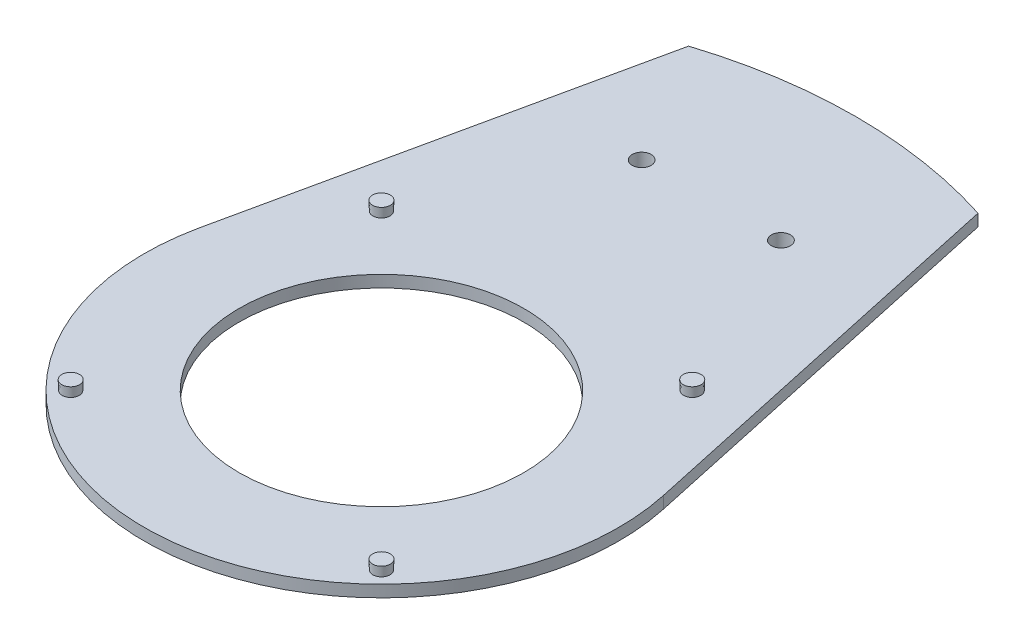
ISO-10303-21;
HEADER;
FILE_DESCRIPTION(('STEP AP214'),'2;1');
FILE_NAME('part.step','',(''),(''),'','','');
FILE_SCHEMA(('AUTOMOTIVE_DESIGN { 1 0 10303 214 1 1 1 1 }'));
ENDSEC;
DATA;
#1=APPLICATION_CONTEXT('core data for automotive mechanical design processes');
#2=APPLICATION_PROTOCOL_DEFINITION('international standard','automotive_design',2000,#1);
#3=PRODUCT_CONTEXT('',#1,'mechanical');
#4=PRODUCT('Part','Part','',(#3));
#5=PRODUCT_RELATED_PRODUCT_CATEGORY('part','',(#4));
#6=PRODUCT_DEFINITION_FORMATION('','',#4);
#7=PRODUCT_DEFINITION_CONTEXT('part definition',#1,'design');
#8=PRODUCT_DEFINITION('design','',#6,#7);
#9=PRODUCT_DEFINITION_SHAPE('','',#8);
#10=(LENGTH_UNIT() NAMED_UNIT(*) SI_UNIT(.MILLI.,.METRE.));
#11=(NAMED_UNIT(*) PLANE_ANGLE_UNIT() SI_UNIT($,.RADIAN.));
#12=(NAMED_UNIT(*) SI_UNIT($,.STERADIAN.) SOLID_ANGLE_UNIT());
#13=UNCERTAINTY_MEASURE_WITH_UNIT(LENGTH_MEASURE(1.E-05),#10,'distance_accuracy_value','');
#14=(GEOMETRIC_REPRESENTATION_CONTEXT(3) GLOBAL_UNCERTAINTY_ASSIGNED_CONTEXT((#13)) GLOBAL_UNIT_ASSIGNED_CONTEXT((#10,
#11,#12)) REPRESENTATION_CONTEXT('',''));
#15=CARTESIAN_POINT('',(0.,0.,0.));
#16=DIRECTION('',(0.,0.,1.));
#17=DIRECTION('',(1.,0.,0.));
#18=AXIS2_PLACEMENT_3D('',#15,#16,#17);
#19=CARTESIAN_POINT('',(0.,0.,0.));
#20=DIRECTION('',(0.,1.,0.));
#21=DIRECTION('',(0.,0.,1.));
#22=AXIS2_PLACEMENT_3D('',#19,#20,#21);
#23=PLANE('',#22);
#24=CARTESIAN_POINT('',(0.,0.,0.));
#25=DIRECTION('',(0.,-1.,0.));
#26=DIRECTION('',(0.,0.,-1.));
#27=AXIS2_PLACEMENT_3D('',#24,#25,#26);
#28=CIRCLE('',#27,50.);
#29=CARTESIAN_POINT('',(48.8630664556427,0.,-10.6019213613123));
#30=VERTEX_POINT('',#29);
#31=CARTESIAN_POINT('',(-48.8630664556426,0.,-10.6019213613123));
#32=VERTEX_POINT('',#31);
#33=EDGE_CURVE('E109',#30,#32,#28,.T.);
#34=ORIENTED_EDGE('',*,*,#33,.T.);
#35=DIRECTION('',(-0.212038427226246,0.,0.977261329112853));
#36=VECTOR('',#35,1.);
#37=CARTESIAN_POINT('',(-48.8630664556426,0.,-10.6019213613123));
#38=LINE('',#37,#36);
#39=CARTESIAN_POINT('',(-30.5,0.,-95.2352350760999));
#40=VERTEX_POINT('',#39);
#41=EDGE_CURVE('E106',#40,#32,#38,.T.);
#42=ORIENTED_EDGE('',*,*,#41,.F.);
#43=CARTESIAN_POINT('',(0.,0.,0.));
#44=DIRECTION('',(0.,1.,0.));
#45=DIRECTION('',(0.,0.,1.));
#46=AXIS2_PLACEMENT_3D('',#43,#44,#45);
#47=CIRCLE('',#46,100.);
#48=CARTESIAN_POINT('',(30.5,0.,-95.2352350760999));
#49=VERTEX_POINT('',#48);
#50=EDGE_CURVE('E120',#49,#40,#47,.T.);
#51=ORIENTED_EDGE('',*,*,#50,.F.);
#52=DIRECTION('',(0.212038427226246,0.,0.977261329112853));
#53=VECTOR('',#52,1.);
#54=CARTESIAN_POINT('',(48.8630664556427,0.,-10.6019213613123));
#55=LINE('',#54,#53);
#56=EDGE_CURVE('E102',#49,#30,#55,.T.);
#57=ORIENTED_EDGE('',*,*,#56,.T.);
#58=EDGE_LOOP('',(#34,#42,#51,#57));
#59=FACE_BOUND('',#58,.T.);
#60=CARTESIAN_POINT('',(0.,0.,0.));
#61=DIRECTION('',(0.,1.,0.));
#62=DIRECTION('',(0.,0.,1.));
#63=AXIS2_PLACEMENT_3D('',#60,#61,#62);
#64=CIRCLE('',#63,30.);
#65=CARTESIAN_POINT('',(0.,0.,30.));
#66=VERTEX_POINT('',#65);
#67=EDGE_CURVE('E193',#66,#66,#64,.T.);
#68=ORIENTED_EDGE('',*,*,#67,.T.);
#69=EDGE_LOOP('',(#68));
#70=FACE_BOUND('',#69,.T.);
#71=DIRECTION('',(0.,0.,1.));
#72=VECTOR('',#71,1.);
#73=CARTESIAN_POINT('',(21.5,0.,0.));
#74=LINE('',#73,#72);
#75=CARTESIAN_POINT('',(21.5,0.,-84.45));
#76=VERTEX_POINT('',#75);
#77=CARTESIAN_POINT('',(21.5,0.,-54.45));
#78=VERTEX_POINT('',#77);
#79=EDGE_CURVE('E140',#76,#78,#74,.T.);
#80=ORIENTED_EDGE('',*,*,#79,.F.);
#81=DIRECTION('',(-1.,0.,0.));
#82=VECTOR('',#81,1.);
#83=CARTESIAN_POINT('',(0.,0.,-84.45));
#84=LINE('',#83,#82);
#85=CARTESIAN_POINT('',(-21.5,0.,-84.45));
#86=VERTEX_POINT('',#85);
#87=EDGE_CURVE('E145',#76,#86,#84,.T.);
#88=ORIENTED_EDGE('',*,*,#87,.T.);
#89=DIRECTION('',(0.,0.,1.));
#90=VECTOR('',#89,1.);
#91=CARTESIAN_POINT('',(-21.5,0.,0.));
#92=LINE('',#91,#90);
#93=CARTESIAN_POINT('',(-21.5,0.,-54.45));
#94=VERTEX_POINT('',#93);
#95=EDGE_CURVE('E59',#86,#94,#92,.T.);
#96=ORIENTED_EDGE('',*,*,#95,.T.);
#97=DIRECTION('',(-1.,0.,0.));
#98=VECTOR('',#97,1.);
#99=CARTESIAN_POINT('',(0.,0.,-54.45));
#100=LINE('',#99,#98);
#101=EDGE_CURVE('E156',#78,#94,#100,.T.);
#102=ORIENTED_EDGE('',*,*,#101,.F.);
#103=EDGE_LOOP('',(#80,#88,#96,#102));
#104=FACE_BOUND('',#103,.T.);
#105=ADVANCED_FACE('F36',(#59,#70,#104),#23,.F.);
#106=CARTESIAN_POINT('',(0.,2.5,0.));
#107=DIRECTION('',(0.,-1.,0.));
#108=DIRECTION('',(0.,0.,-1.));
#109=AXIS2_PLACEMENT_3D('',#106,#107,#108);
#110=CYLINDRICAL_SURFACE('',#109,30.);
#111=CARTESIAN_POINT('',(0.,2.5,0.));
#112=DIRECTION('',(0.,1.,0.));
#113=DIRECTION('',(0.,0.,1.));
#114=AXIS2_PLACEMENT_3D('',#111,#112,#113);
#115=CIRCLE('',#114,30.);
#116=CARTESIAN_POINT('',(0.,2.5,30.));
#117=VERTEX_POINT('',#116);
#118=EDGE_CURVE('E194',#117,#117,#115,.T.);
#119=ORIENTED_EDGE('',*,*,#118,.T.);
#120=EDGE_LOOP('',(#119));
#121=FACE_BOUND('',#120,.T.);
#122=ORIENTED_EDGE('',*,*,#67,.F.);
#123=EDGE_LOOP('',(#122));
#124=FACE_BOUND('',#123,.T.);
#125=ADVANCED_FACE('F38',(#121,#124),#110,.F.);
#126=CARTESIAN_POINT('',(0.,2.5,0.));
#127=DIRECTION('',(0.,-1.,0.));
#128=DIRECTION('',(0.,0.,-1.));
#129=AXIS2_PLACEMENT_3D('',#126,#127,#128);
#130=CYLINDRICAL_SURFACE('',#129,100.);
#131=ORIENTED_EDGE('',*,*,#50,.T.);
#132=DIRECTION('',(0.,-1.,0.));
#133=VECTOR('',#132,1.);
#134=CARTESIAN_POINT('',(-30.5,4.5,-95.2352350760999));
#135=LINE('',#134,#133);
#136=CARTESIAN_POINT('',(-30.5,2.5,-95.2352350760999));
#137=VERTEX_POINT('',#136);
#138=EDGE_CURVE('E126',#137,#40,#135,.T.);
#139=ORIENTED_EDGE('',*,*,#138,.F.);
#140=CARTESIAN_POINT('',(0.,2.5,0.));
#141=DIRECTION('',(0.,1.,0.));
#142=DIRECTION('',(0.,0.,1.));
#143=AXIS2_PLACEMENT_3D('',#140,#141,#142);
#144=CIRCLE('',#143,100.);
#145=CARTESIAN_POINT('',(30.5,2.5,-95.2352350760999));
#146=VERTEX_POINT('',#145);
#147=EDGE_CURVE('E197',#146,#137,#144,.T.);
#148=ORIENTED_EDGE('',*,*,#147,.F.);
#149=DIRECTION('',(0.,-1.,0.));
#150=VECTOR('',#149,1.);
#151=CARTESIAN_POINT('',(30.5,4.5,-95.2352350760999));
#152=LINE('',#151,#150);
#153=EDGE_CURVE('E51',#146,#49,#152,.T.);
#154=ORIENTED_EDGE('',*,*,#153,.T.);
#155=EDGE_LOOP('',(#131,#139,#148,#154));
#156=FACE_BOUND('',#155,.T.);
#157=ADVANCED_FACE('F212',(#156),#130,.T.);
#158=CARTESIAN_POINT('',(0.,2.5,0.));
#159=DIRECTION('',(0.,1.,0.));
#160=DIRECTION('',(0.,0.,1.));
#161=AXIS2_PLACEMENT_3D('',#158,#159,#160);
#162=PLANE('',#161);
#163=DIRECTION('',(0.212038427226246,0.,-0.977261329112853));
#164=VECTOR('',#163,1.);
#165=CARTESIAN_POINT('',(-48.8630664556426,2.5,-10.6019213613123));
#166=LINE('',#165,#164);
#167=CARTESIAN_POINT('',(-48.8630664556426,2.5,-10.6019213613123));
#168=VERTEX_POINT('',#167);
#169=EDGE_CURVE('E11',#168,#137,#166,.T.);
#170=ORIENTED_EDGE('',*,*,#169,.F.);
#171=CARTESIAN_POINT('',(0.,2.5,0.));
#172=DIRECTION('',(0.,1.,0.));
#173=DIRECTION('',(0.,0.,1.));
#174=AXIS2_PLACEMENT_3D('',#171,#172,#173);
#175=CIRCLE('',#174,50.);
#176=CARTESIAN_POINT('',(48.8630664556427,2.5,-10.6019213613123));
#177=VERTEX_POINT('',#176);
#178=EDGE_CURVE('E44',#168,#177,#175,.T.);
#179=ORIENTED_EDGE('',*,*,#178,.T.);
#180=DIRECTION('',(-0.212038427226246,0.,-0.977261329112853));
#181=VECTOR('',#180,1.);
#182=CARTESIAN_POINT('',(48.8630664556427,2.5,-10.6019213613123));
#183=LINE('',#182,#181);
#184=EDGE_CURVE('E103',#177,#146,#183,.T.);
#185=ORIENTED_EDGE('',*,*,#184,.T.);
#186=ORIENTED_EDGE('',*,*,#147,.T.);
#187=EDGE_LOOP('',(#170,#179,#185,#186));
#188=FACE_BOUND('',#187,.T.);
#189=CARTESIAN_POINT('',(-14.6750746066046,2.5,-69.5179450594635));
#190=DIRECTION('',(0.,1.,0.));
#191=DIRECTION('',(0.,0.,1.));
#192=AXIS2_PLACEMENT_3D('',#189,#190,#191);
#193=CIRCLE('',#192,2.);
#194=CARTESIAN_POINT('',(-14.6750746066046,2.5,-67.5179450594635));
#195=VERTEX_POINT('',#194);
#196=EDGE_CURVE('E137',#195,#195,#193,.T.);
#197=ORIENTED_EDGE('',*,*,#196,.F.);
#198=EDGE_LOOP('',(#197));
#199=FACE_BOUND('',#198,.T.);
#200=CARTESIAN_POINT('',(14.6750746066046,2.5,-69.5179450594635));
#201=DIRECTION('',(0.,1.,0.));
#202=DIRECTION('',(0.,0.,1.));
#203=AXIS2_PLACEMENT_3D('',#200,#201,#202);
#204=CIRCLE('',#203,2.00000000000001);
#205=CARTESIAN_POINT('',(14.6750746066046,2.5,-67.5179450594635));
#206=VERTEX_POINT('',#205);
#207=EDGE_CURVE('E132',#206,#206,#204,.T.);
#208=ORIENTED_EDGE('',*,*,#207,.F.);
#209=EDGE_LOOP('',(#208));
#210=FACE_BOUND('',#209,.T.);
#211=CARTESIAN_POINT('',(32.75,2.5,-32.75));
#212=DIRECTION('',(0.,1.,0.));
#213=DIRECTION('',(0.,0.,1.));
#214=AXIS2_PLACEMENT_3D('',#211,#212,#213);
#215=CIRCLE('',#214,1.8);
#216=CARTESIAN_POINT('',(32.75,2.5,-30.95));
#217=VERTEX_POINT('',#216);
#218=EDGE_CURVE('E169',#217,#217,#215,.T.);
#219=ORIENTED_EDGE('',*,*,#218,.F.);
#220=EDGE_LOOP('',(#219));
#221=FACE_BOUND('',#220,.T.);
#222=CARTESIAN_POINT('',(32.75,2.5,32.75));
#223=DIRECTION('',(0.,1.,0.));
#224=DIRECTION('',(0.,0.,1.));
#225=AXIS2_PLACEMENT_3D('',#222,#223,#224);
#226=CIRCLE('',#225,1.8);
#227=CARTESIAN_POINT('',(32.75,2.5,34.55));
#228=VERTEX_POINT('',#227);
#229=EDGE_CURVE('E175',#228,#228,#226,.T.);
#230=ORIENTED_EDGE('',*,*,#229,.F.);
#231=EDGE_LOOP('',(#230));
#232=FACE_BOUND('',#231,.T.);
#233=CARTESIAN_POINT('',(-32.75,2.5,32.75));
#234=DIRECTION('',(0.,1.,0.));
#235=DIRECTION('',(0.,0.,1.));
#236=AXIS2_PLACEMENT_3D('',#233,#234,#235);
#237=CIRCLE('',#236,1.8);
#238=CARTESIAN_POINT('',(-32.75,2.5,34.55));
#239=VERTEX_POINT('',#238);
#240=EDGE_CURVE('E181',#239,#239,#237,.T.);
#241=ORIENTED_EDGE('',*,*,#240,.F.);
#242=EDGE_LOOP('',(#241));
#243=FACE_BOUND('',#242,.T.);
#244=CARTESIAN_POINT('',(-32.75,2.5,-32.75));
#245=DIRECTION('',(0.,1.,0.));
#246=DIRECTION('',(0.,0.,1.));
#247=AXIS2_PLACEMENT_3D('',#244,#245,#246);
#248=CIRCLE('',#247,1.8);
#249=CARTESIAN_POINT('',(-32.75,2.5,-30.95));
#250=VERTEX_POINT('',#249);
#251=EDGE_CURVE('E187',#250,#250,#248,.T.);
#252=ORIENTED_EDGE('',*,*,#251,.F.);
#253=EDGE_LOOP('',(#252));
#254=FACE_BOUND('',#253,.T.);
#255=ORIENTED_EDGE('',*,*,#118,.F.);
#256=EDGE_LOOP('',(#255));
#257=FACE_BOUND('',#256,.T.);
#258=ADVANCED_FACE('F205',(#188,#199,#210,#221,#232,#243,#254,#257),#162,.T.);
#259=CARTESIAN_POINT('',(-32.75,2.5,-32.75));
#260=DIRECTION('',(0.,1.,0.));
#261=DIRECTION('',(0.,0.,1.));
#262=AXIS2_PLACEMENT_3D('',#259,#260,#261);
#263=CONICAL_SURFACE('',#262,1.8,0.0349065850398867);
#264=CARTESIAN_POINT('',(-32.75,4.5,-32.75));
#265=DIRECTION('',(0.,1.,0.));
#266=DIRECTION('',(0.,0.,1.));
#267=AXIS2_PLACEMENT_3D('',#264,#265,#266);
#268=CIRCLE('',#267,1.8698415389835);
#269=CARTESIAN_POINT('',(-32.75,4.5,-30.8801584610165));
#270=VERTEX_POINT('',#269);
#271=EDGE_CURVE('E190',#270,#270,#268,.T.);
#272=ORIENTED_EDGE('',*,*,#271,.F.);
#273=EDGE_LOOP('',(#272));
#274=FACE_BOUND('',#273,.T.);
#275=ORIENTED_EDGE('',*,*,#251,.T.);
#276=EDGE_LOOP('',(#275));
#277=FACE_BOUND('',#276,.T.);
#278=ADVANCED_FACE('F218',(#274,#277),#263,.T.);
#279=CARTESIAN_POINT('',(-32.75,4.5,-32.75));
#280=DIRECTION('',(0.,1.,0.));
#281=DIRECTION('',(0.,0.,1.));
#282=AXIS2_PLACEMENT_3D('',#279,#280,#281);
#283=PLANE('',#282);
#284=ORIENTED_EDGE('',*,*,#271,.T.);
#285=EDGE_LOOP('',(#284));
#286=FACE_BOUND('',#285,.T.);
#287=ADVANCED_FACE('F228',(#286),#283,.T.);
#288=CARTESIAN_POINT('',(-32.75,2.5,32.75));
#289=DIRECTION('',(0.,1.,0.));
#290=DIRECTION('',(0.,0.,1.));
#291=AXIS2_PLACEMENT_3D('',#288,#289,#290);
#292=CONICAL_SURFACE('',#291,1.8,0.0349065850398867);
#293=CARTESIAN_POINT('',(-32.75,4.5,32.75));
#294=DIRECTION('',(0.,1.,0.));
#295=DIRECTION('',(0.,0.,1.));
#296=AXIS2_PLACEMENT_3D('',#293,#294,#295);
#297=CIRCLE('',#296,1.8698415389835);
#298=CARTESIAN_POINT('',(-32.75,4.5,34.6198415389835));
#299=VERTEX_POINT('',#298);
#300=EDGE_CURVE('E184',#299,#299,#297,.T.);
#301=ORIENTED_EDGE('',*,*,#300,.F.);
#302=EDGE_LOOP('',(#301));
#303=FACE_BOUND('',#302,.T.);
#304=ORIENTED_EDGE('',*,*,#240,.T.);
#305=EDGE_LOOP('',(#304));
#306=FACE_BOUND('',#305,.T.);
#307=ADVANCED_FACE('F232',(#303,#306),#292,.T.);
#308=CARTESIAN_POINT('',(-32.75,4.5,32.75));
#309=DIRECTION('',(0.,1.,0.));
#310=DIRECTION('',(0.,0.,1.));
#311=AXIS2_PLACEMENT_3D('',#308,#309,#310);
#312=PLANE('',#311);
#313=ORIENTED_EDGE('',*,*,#300,.T.);
#314=EDGE_LOOP('',(#313));
#315=FACE_BOUND('',#314,.T.);
#316=ADVANCED_FACE('F236',(#315),#312,.T.);
#317=CARTESIAN_POINT('',(32.75,2.5,32.75));
#318=DIRECTION('',(0.,1.,0.));
#319=DIRECTION('',(0.,0.,1.));
#320=AXIS2_PLACEMENT_3D('',#317,#318,#319);
#321=CONICAL_SURFACE('',#320,1.8,0.0349065850398867);
#322=CARTESIAN_POINT('',(32.75,4.5,32.75));
#323=DIRECTION('',(0.,1.,0.));
#324=DIRECTION('',(0.,0.,1.));
#325=AXIS2_PLACEMENT_3D('',#322,#323,#324);
#326=CIRCLE('',#325,1.8698415389835);
#327=CARTESIAN_POINT('',(32.75,4.5,34.6198415389835));
#328=VERTEX_POINT('',#327);
#329=EDGE_CURVE('E178',#328,#328,#326,.T.);
#330=ORIENTED_EDGE('',*,*,#329,.F.);
#331=EDGE_LOOP('',(#330));
#332=FACE_BOUND('',#331,.T.);
#333=ORIENTED_EDGE('',*,*,#229,.T.);
#334=EDGE_LOOP('',(#333));
#335=FACE_BOUND('',#334,.T.);
#336=ADVANCED_FACE('F240',(#332,#335),#321,.T.);
#337=CARTESIAN_POINT('',(32.75,4.5,32.75));
#338=DIRECTION('',(0.,1.,0.));
#339=DIRECTION('',(0.,0.,1.));
#340=AXIS2_PLACEMENT_3D('',#337,#338,#339);
#341=PLANE('',#340);
#342=ORIENTED_EDGE('',*,*,#329,.T.);
#343=EDGE_LOOP('',(#342));
#344=FACE_BOUND('',#343,.T.);
#345=ADVANCED_FACE('F244',(#344),#341,.T.);
#346=CARTESIAN_POINT('',(32.75,2.5,-32.75));
#347=DIRECTION('',(0.,1.,0.));
#348=DIRECTION('',(0.,0.,1.));
#349=AXIS2_PLACEMENT_3D('',#346,#347,#348);
#350=CONICAL_SURFACE('',#349,1.8,0.0349065850398867);
#351=CARTESIAN_POINT('',(32.75,4.5,-32.75));
#352=DIRECTION('',(0.,1.,0.));
#353=DIRECTION('',(0.,0.,1.));
#354=AXIS2_PLACEMENT_3D('',#351,#352,#353);
#355=CIRCLE('',#354,1.8698415389835);
#356=CARTESIAN_POINT('',(32.75,4.5,-30.8801584610165));
#357=VERTEX_POINT('',#356);
#358=EDGE_CURVE('E172',#357,#357,#355,.T.);
#359=ORIENTED_EDGE('',*,*,#358,.F.);
#360=EDGE_LOOP('',(#359));
#361=FACE_BOUND('',#360,.T.);
#362=ORIENTED_EDGE('',*,*,#218,.T.);
#363=EDGE_LOOP('',(#362));
#364=FACE_BOUND('',#363,.T.);
#365=ADVANCED_FACE('F248',(#361,#364),#350,.T.);
#366=CARTESIAN_POINT('',(32.75,4.5,-32.75));
#367=DIRECTION('',(0.,1.,0.));
#368=DIRECTION('',(0.,0.,1.));
#369=AXIS2_PLACEMENT_3D('',#366,#367,#368);
#370=PLANE('',#369);
#371=ORIENTED_EDGE('',*,*,#358,.T.);
#372=EDGE_LOOP('',(#371));
#373=FACE_BOUND('',#372,.T.);
#374=ADVANCED_FACE('F252',(#373),#370,.T.);
#375=CARTESIAN_POINT('',(21.5,-2.35,0.));
#376=DIRECTION('',(-1.,0.,0.));
#377=DIRECTION('',(0.,0.,1.));
#378=AXIS2_PLACEMENT_3D('',#375,#376,#377);
#379=PLANE('',#378);
#380=ORIENTED_EDGE('',*,*,#79,.T.);
#381=DIRECTION('',(0.,1.,0.));
#382=VECTOR('',#381,1.);
#383=CARTESIAN_POINT('',(21.5,-2.35,-54.45));
#384=LINE('',#383,#382);
#385=CARTESIAN_POINT('',(21.5,-2.35,-54.45));
#386=VERTEX_POINT('',#385);
#387=EDGE_CURVE('E167',#386,#78,#384,.T.);
#388=ORIENTED_EDGE('',*,*,#387,.F.);
#389=DIRECTION('',(0.,0.,1.));
#390=VECTOR('',#389,1.);
#391=CARTESIAN_POINT('',(21.5,-2.35,0.));
#392=LINE('',#391,#390);
#393=CARTESIAN_POINT('',(21.5,-2.35,-84.45));
#394=VERTEX_POINT('',#393);
#395=EDGE_CURVE('E141',#394,#386,#392,.T.);
#396=ORIENTED_EDGE('',*,*,#395,.F.);
#397=DIRECTION('',(0.,1.,0.));
#398=VECTOR('',#397,1.);
#399=CARTESIAN_POINT('',(21.5,-2.35,-84.45));
#400=LINE('',#399,#398);
#401=EDGE_CURVE('E153',#394,#76,#400,.T.);
#402=ORIENTED_EDGE('',*,*,#401,.T.);
#403=EDGE_LOOP('',(#380,#388,#396,#402));
#404=FACE_BOUND('',#403,.T.);
#405=ADVANCED_FACE('F256',(#404),#379,.F.);
#406=CARTESIAN_POINT('',(0.,-2.35,-54.45));
#407=DIRECTION('',(0.,0.,-1.));
#408=DIRECTION('',(-1.,0.,0.));
#409=AXIS2_PLACEMENT_3D('',#406,#407,#408);
#410=PLANE('',#409);
#411=ORIENTED_EDGE('',*,*,#101,.T.);
#412=DIRECTION('',(0.,1.,0.));
#413=VECTOR('',#412,1.);
#414=CARTESIAN_POINT('',(-21.5,-2.35,-54.45));
#415=LINE('',#414,#413);
#416=CARTESIAN_POINT('',(-21.5,-2.35,-54.45));
#417=VERTEX_POINT('',#416);
#418=EDGE_CURVE('E165',#417,#94,#415,.T.);
#419=ORIENTED_EDGE('',*,*,#418,.F.);
#420=DIRECTION('',(-1.,0.,0.));
#421=VECTOR('',#420,1.);
#422=CARTESIAN_POINT('',(0.,-2.35,-54.45));
#423=LINE('',#422,#421);
#424=EDGE_CURVE('E144',#386,#417,#423,.T.);
#425=ORIENTED_EDGE('',*,*,#424,.F.);
#426=ORIENTED_EDGE('',*,*,#387,.T.);
#427=EDGE_LOOP('',(#411,#419,#425,#426));
#428=FACE_BOUND('',#427,.T.);
#429=ADVANCED_FACE('F260',(#428),#410,.F.);
#430=CARTESIAN_POINT('',(-21.5,-2.35,0.));
#431=DIRECTION('',(-1.,0.,0.));
#432=DIRECTION('',(0.,0.,1.));
#433=AXIS2_PLACEMENT_3D('',#430,#431,#432);
#434=PLANE('',#433);
#435=ORIENTED_EDGE('',*,*,#95,.F.);
#436=DIRECTION('',(0.,1.,0.));
#437=VECTOR('',#436,1.);
#438=CARTESIAN_POINT('',(-21.5,-2.35,-84.45));
#439=LINE('',#438,#437);
#440=CARTESIAN_POINT('',(-21.5,-2.35,-84.45));
#441=VERTEX_POINT('',#440);
#442=EDGE_CURVE('E163',#441,#86,#439,.T.);
#443=ORIENTED_EDGE('',*,*,#442,.F.);
#444=DIRECTION('',(0.,0.,1.));
#445=VECTOR('',#444,1.);
#446=CARTESIAN_POINT('',(-21.5,-2.35,0.));
#447=LINE('',#446,#445);
#448=EDGE_CURVE('E147',#441,#417,#447,.T.);
#449=ORIENTED_EDGE('',*,*,#448,.T.);
#450=ORIENTED_EDGE('',*,*,#418,.T.);
#451=EDGE_LOOP('',(#435,#443,#449,#450));
#452=FACE_BOUND('',#451,.T.);
#453=ADVANCED_FACE('F264',(#452),#434,.T.);
#454=CARTESIAN_POINT('',(0.,-2.35,-84.45));
#455=DIRECTION('',(0.,0.,-1.));
#456=DIRECTION('',(-1.,0.,0.));
#457=AXIS2_PLACEMENT_3D('',#454,#455,#456);
#458=PLANE('',#457);
#459=ORIENTED_EDGE('',*,*,#87,.F.);
#460=ORIENTED_EDGE('',*,*,#401,.F.);
#461=DIRECTION('',(-1.,0.,0.));
#462=VECTOR('',#461,1.);
#463=CARTESIAN_POINT('',(0.,-2.35,-84.45));
#464=LINE('',#463,#462);
#465=EDGE_CURVE('E150',#394,#441,#464,.T.);
#466=ORIENTED_EDGE('',*,*,#465,.T.);
#467=ORIENTED_EDGE('',*,*,#442,.T.);
#468=EDGE_LOOP('',(#459,#460,#466,#467));
#469=FACE_BOUND('',#468,.T.);
#470=ADVANCED_FACE('F268',(#469),#458,.T.);
#471=CARTESIAN_POINT('',(0.,-2.35,0.));
#472=DIRECTION('',(0.,-1.,0.));
#473=DIRECTION('',(0.,0.,-1.));
#474=AXIS2_PLACEMENT_3D('',#471,#472,#473);
#475=PLANE('',#474);
#476=CARTESIAN_POINT('',(-14.6750746066046,-2.35,-69.5179450594635));
#477=DIRECTION('',(0.,-1.,0.));
#478=DIRECTION('',(0.,0.,-1.));
#479=AXIS2_PLACEMENT_3D('',#476,#477,#478);
#480=CIRCLE('',#479,2.);
#481=CARTESIAN_POINT('',(-14.6750746066046,-2.35,-71.5179450594635));
#482=VERTEX_POINT('',#481);
#483=EDGE_CURVE('E129',#482,#482,#480,.T.);
#484=ORIENTED_EDGE('',*,*,#483,.F.);
#485=EDGE_LOOP('',(#484));
#486=FACE_BOUND('',#485,.T.);
#487=CARTESIAN_POINT('',(14.6750746066046,-2.35,-69.5179450594635));
#488=DIRECTION('',(0.,-1.,0.));
#489=DIRECTION('',(0.,0.,-1.));
#490=AXIS2_PLACEMENT_3D('',#487,#488,#489);
#491=CIRCLE('',#490,2.00000000000001);
#492=CARTESIAN_POINT('',(14.6750746066046,-2.35,-71.5179450594635));
#493=VERTEX_POINT('',#492);
#494=EDGE_CURVE('E125',#493,#493,#491,.T.);
#495=ORIENTED_EDGE('',*,*,#494,.F.);
#496=EDGE_LOOP('',(#495));
#497=FACE_BOUND('',#496,.T.);
#498=ORIENTED_EDGE('',*,*,#395,.T.);
#499=ORIENTED_EDGE('',*,*,#424,.T.);
#500=ORIENTED_EDGE('',*,*,#448,.F.);
#501=ORIENTED_EDGE('',*,*,#465,.F.);
#502=EDGE_LOOP('',(#498,#499,#500,#501));
#503=FACE_BOUND('',#502,.T.);
#504=ADVANCED_FACE('F271',(#486,#497,#503),#475,.T.);
#505=CARTESIAN_POINT('',(14.6750746066046,4.5,-69.5179450594635));
#506=DIRECTION('',(0.,-1.,0.));
#507=DIRECTION('',(0.,0.,-1.));
#508=AXIS2_PLACEMENT_3D('',#505,#506,#507);
#509=CYLINDRICAL_SURFACE('',#508,2.00000000000001);
#510=ORIENTED_EDGE('',*,*,#207,.T.);
#511=EDGE_LOOP('',(#510));
#512=FACE_BOUND('',#511,.T.);
#513=ORIENTED_EDGE('',*,*,#494,.T.);
#514=EDGE_LOOP('',(#513));
#515=FACE_BOUND('',#514,.T.);
#516=ADVANCED_FACE('F275',(#512,#515),#509,.F.);
#517=CARTESIAN_POINT('',(-14.6750746066046,4.5,-69.5179450594635));
#518=DIRECTION('',(0.,-1.,0.));
#519=DIRECTION('',(0.,0.,-1.));
#520=AXIS2_PLACEMENT_3D('',#517,#518,#519);
#521=CYLINDRICAL_SURFACE('',#520,2.);
#522=ORIENTED_EDGE('',*,*,#196,.T.);
#523=EDGE_LOOP('',(#522));
#524=FACE_BOUND('',#523,.T.);
#525=ORIENTED_EDGE('',*,*,#483,.T.);
#526=EDGE_LOOP('',(#525));
#527=FACE_BOUND('',#526,.T.);
#528=ADVANCED_FACE('F279',(#524,#527),#521,.F.);
#529=CARTESIAN_POINT('',(0.,4.5,0.));
#530=DIRECTION('',(0.,-1.,0.));
#531=DIRECTION('',(0.,0.,-1.));
#532=AXIS2_PLACEMENT_3D('',#529,#530,#531);
#533=CYLINDRICAL_SURFACE('',#532,50.);
#534=DIRECTION('',(0.,-1.,0.));
#535=VECTOR('',#534,1.);
#536=CARTESIAN_POINT('',(-48.8630664556426,4.5,-10.6019213613123));
#537=LINE('',#536,#535);
#538=EDGE_CURVE('E112',#168,#32,#537,.T.);
#539=ORIENTED_EDGE('',*,*,#538,.T.);
#540=ORIENTED_EDGE('',*,*,#33,.F.);
#541=DIRECTION('',(0.,-1.,0.));
#542=VECTOR('',#541,1.);
#543=CARTESIAN_POINT('',(48.8630664556427,4.5,-10.6019213613123));
#544=LINE('',#543,#542);
#545=EDGE_CURVE('E98',#177,#30,#544,.T.);
#546=ORIENTED_EDGE('',*,*,#545,.F.);
#547=ORIENTED_EDGE('',*,*,#178,.F.);
#548=EDGE_LOOP('',(#539,#540,#546,#547));
#549=FACE_BOUND('',#548,.T.);
#550=ADVANCED_FACE('F110',(#549),#533,.T.);
#551=CARTESIAN_POINT('',(-48.8630664556426,4.5,-10.6019213613123));
#552=DIRECTION('',(0.977261329112853,0.,0.212038427226246));
#553=DIRECTION('',(0.212038427226246,0.,-0.977261329112853));
#554=AXIS2_PLACEMENT_3D('',#551,#552,#553);
#555=PLANE('',#554);
#556=ORIENTED_EDGE('',*,*,#169,.T.);
#557=ORIENTED_EDGE('',*,*,#138,.T.);
#558=ORIENTED_EDGE('',*,*,#41,.T.);
#559=ORIENTED_EDGE('',*,*,#538,.F.);
#560=EDGE_LOOP('',(#556,#557,#558,#559));
#561=FACE_BOUND('',#560,.T.);
#562=ADVANCED_FACE('F209',(#561),#555,.F.);
#563=CARTESIAN_POINT('',(48.8630664556427,4.5,-10.6019213613123));
#564=DIRECTION('',(0.977261329112853,0.,-0.212038427226246));
#565=DIRECTION('',(-0.212038427226246,0.,-0.977261329112853));
#566=AXIS2_PLACEMENT_3D('',#563,#564,#565);
#567=PLANE('',#566);
#568=ORIENTED_EDGE('',*,*,#545,.T.);
#569=ORIENTED_EDGE('',*,*,#56,.F.);
#570=ORIENTED_EDGE('',*,*,#153,.F.);
#571=ORIENTED_EDGE('',*,*,#184,.F.);
#572=EDGE_LOOP('',(#568,#569,#570,#571));
#573=FACE_BOUND('',#572,.T.);
#574=ADVANCED_FACE('F100',(#573),#567,.T.);
#575=CLOSED_SHELL('',(#105,#125,#157,#258,#278,#287,#307,#316,#336,#345,#365,#374,#405,#429,
#453,#470,#504,#516,#528,#550,#562,#574));
#576=MANIFOLD_SOLID_BREP('B2',#575);
#577=ADVANCED_BREP_SHAPE_REPRESENTATION('',(#18,#576),#14);
#578=SHAPE_DEFINITION_REPRESENTATION(#9,#577);
ENDSEC;
END-ISO-10303-21;
